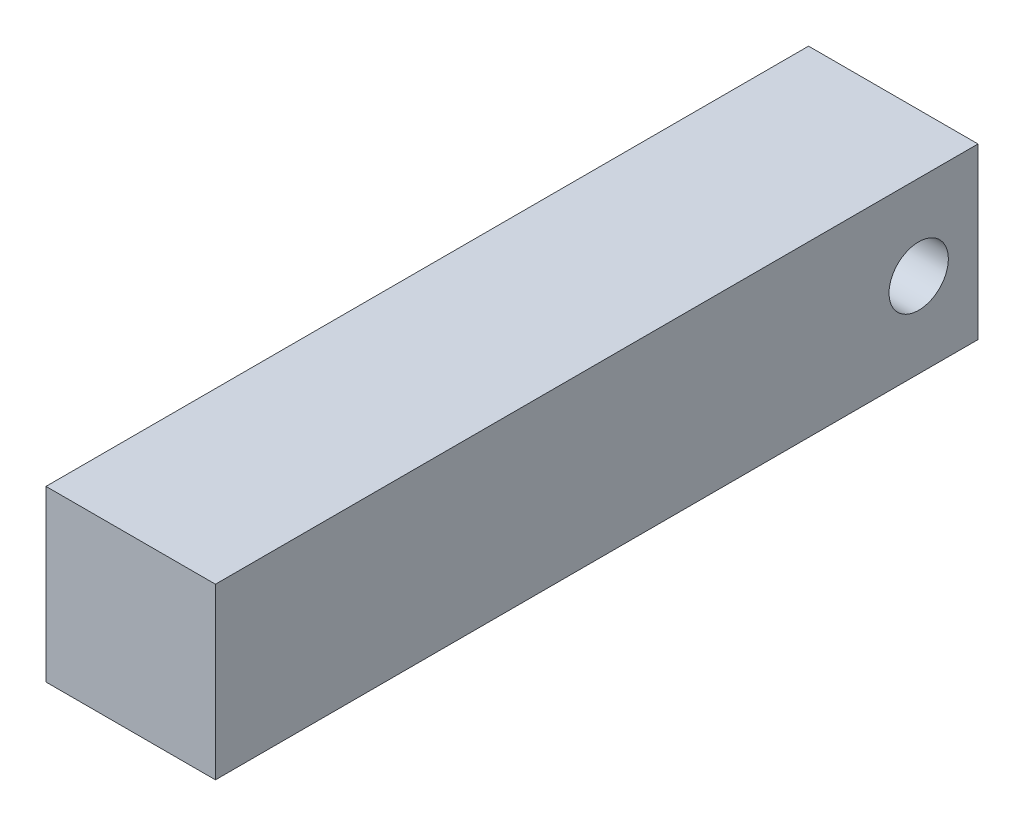
ISO-10303-21;
HEADER;
FILE_DESCRIPTION(('STEP AP214'),'2;1');
FILE_NAME('part.step','',(''),(''),'','','');
FILE_SCHEMA(('AUTOMOTIVE_DESIGN { 1 0 10303 214 1 1 1 1 }'));
ENDSEC;
DATA;
#1=APPLICATION_CONTEXT('core data for automotive mechanical design processes');
#2=APPLICATION_PROTOCOL_DEFINITION('international standard','automotive_design',2000,#1);
#3=PRODUCT_CONTEXT('',#1,'mechanical');
#4=PRODUCT('Part','Part','',(#3));
#5=PRODUCT_RELATED_PRODUCT_CATEGORY('part','',(#4));
#6=PRODUCT_DEFINITION_FORMATION('','',#4);
#7=PRODUCT_DEFINITION_CONTEXT('part definition',#1,'design');
#8=PRODUCT_DEFINITION('design','',#6,#7);
#9=PRODUCT_DEFINITION_SHAPE('','',#8);
#10=(LENGTH_UNIT() NAMED_UNIT(*) SI_UNIT(.MILLI.,.METRE.));
#11=(NAMED_UNIT(*) PLANE_ANGLE_UNIT() SI_UNIT($,.RADIAN.));
#12=(NAMED_UNIT(*) SI_UNIT($,.STERADIAN.) SOLID_ANGLE_UNIT());
#13=UNCERTAINTY_MEASURE_WITH_UNIT(LENGTH_MEASURE(1.E-05),#10,'distance_accuracy_value','');
#14=(GEOMETRIC_REPRESENTATION_CONTEXT(3) GLOBAL_UNCERTAINTY_ASSIGNED_CONTEXT((#13)) GLOBAL_UNIT_ASSIGNED_CONTEXT((#10,
#11,#12)) REPRESENTATION_CONTEXT('',''));
#15=CARTESIAN_POINT('',(0.,0.,0.));
#16=DIRECTION('',(0.,0.,1.));
#17=DIRECTION('',(1.,0.,0.));
#18=AXIS2_PLACEMENT_3D('',#15,#16,#17);
#19=CARTESIAN_POINT('',(0.,0.,45.));
#20=DIRECTION('',(0.,1.,0.));
#21=DIRECTION('',(0.,0.,1.));
#22=AXIS2_PLACEMENT_3D('',#19,#20,#21);
#23=PLANE('',#22);
#24=DIRECTION('',(1.,0.,0.));
#25=VECTOR('',#24,1.);
#26=CARTESIAN_POINT('',(0.,0.,0.));
#27=LINE('',#26,#25);
#28=CARTESIAN_POINT('',(0.,0.,0.));
#29=VERTEX_POINT('',#28);
#30=CARTESIAN_POINT('',(10.,0.,0.));
#31=VERTEX_POINT('',#30);
#32=EDGE_CURVE('E164',#29,#31,#27,.T.);
#33=ORIENTED_EDGE('',*,*,#32,.F.);
#34=DIRECTION('',(0.,0.,-1.));
#35=VECTOR('',#34,1.);
#36=CARTESIAN_POINT('',(0.,0.,45.));
#37=LINE('',#36,#35);
#38=CARTESIAN_POINT('',(0.,0.,45.));
#39=VERTEX_POINT('',#38);
#40=EDGE_CURVE('E11',#39,#29,#37,.T.);
#41=ORIENTED_EDGE('',*,*,#40,.F.);
#42=DIRECTION('',(1.,0.,0.));
#43=VECTOR('',#42,1.);
#44=CARTESIAN_POINT('',(0.,0.,45.));
#45=LINE('',#44,#43);
#46=CARTESIAN_POINT('',(10.,0.,45.));
#47=VERTEX_POINT('',#46);
#48=EDGE_CURVE('E173',#39,#47,#45,.T.);
#49=ORIENTED_EDGE('',*,*,#48,.T.);
#50=DIRECTION('',(0.,0.,-1.));
#51=VECTOR('',#50,1.);
#52=CARTESIAN_POINT('',(10.,0.,45.));
#53=LINE('',#52,#51);
#54=EDGE_CURVE('E48',#47,#31,#53,.T.);
#55=ORIENTED_EDGE('',*,*,#54,.T.);
#56=EDGE_LOOP('',(#33,#41,#49,#55));
#57=FACE_BOUND('',#56,.T.);
#58=ADVANCED_FACE('F44',(#57),#23,.T.);
#59=CARTESIAN_POINT('',(0.,0.,45.));
#60=DIRECTION('',(1.,0.,0.));
#61=DIRECTION('',(0.,1.,0.));
#62=AXIS2_PLACEMENT_3D('',#59,#60,#61);
#63=PLANE('',#62);
#64=DIRECTION('',(0.,-1.,0.));
#65=VECTOR('',#64,1.);
#66=CARTESIAN_POINT('',(0.,0.,0.));
#67=LINE('',#66,#65);
#68=CARTESIAN_POINT('',(0.,-10.,0.));
#69=VERTEX_POINT('',#68);
#70=EDGE_CURVE('E171',#29,#69,#67,.T.);
#71=ORIENTED_EDGE('',*,*,#70,.T.);
#72=DIRECTION('',(0.,0.,-1.));
#73=VECTOR('',#72,1.);
#74=CARTESIAN_POINT('',(0.,-10.,45.));
#75=LINE('',#74,#73);
#76=CARTESIAN_POINT('',(0.,-10.,45.));
#77=VERTEX_POINT('',#76);
#78=EDGE_CURVE('E53',#77,#69,#75,.T.);
#79=ORIENTED_EDGE('',*,*,#78,.F.);
#80=DIRECTION('',(0.,-1.,0.));
#81=VECTOR('',#80,1.);
#82=CARTESIAN_POINT('',(0.,0.,45.));
#83=LINE('',#82,#81);
#84=EDGE_CURVE('E182',#39,#77,#83,.T.);
#85=ORIENTED_EDGE('',*,*,#84,.F.);
#86=ORIENTED_EDGE('',*,*,#40,.T.);
#87=EDGE_LOOP('',(#71,#79,#85,#86));
#88=FACE_BOUND('',#87,.T.);
#89=ADVANCED_FACE('F207',(#88),#63,.F.);
#90=CARTESIAN_POINT('',(0.,-10.,45.));
#91=DIRECTION('',(0.,1.,0.));
#92=DIRECTION('',(0.,0.,1.));
#93=AXIS2_PLACEMENT_3D('',#90,#91,#92);
#94=PLANE('',#93);
#95=DIRECTION('',(1.,0.,0.));
#96=VECTOR('',#95,1.);
#97=CARTESIAN_POINT('',(0.,-10.,0.));
#98=LINE('',#97,#96);
#99=CARTESIAN_POINT('',(10.,-10.,0.));
#100=VERTEX_POINT('',#99);
#101=EDGE_CURVE('E193',#69,#100,#98,.T.);
#102=ORIENTED_EDGE('',*,*,#101,.T.);
#103=DIRECTION('',(0.,0.,-1.));
#104=VECTOR('',#103,1.);
#105=CARTESIAN_POINT('',(10.,-10.,45.));
#106=LINE('',#105,#104);
#107=CARTESIAN_POINT('',(10.,-10.,45.));
#108=VERTEX_POINT('',#107);
#109=EDGE_CURVE('E200',#108,#100,#106,.T.);
#110=ORIENTED_EDGE('',*,*,#109,.F.);
#111=DIRECTION('',(1.,0.,0.));
#112=VECTOR('',#111,1.);
#113=CARTESIAN_POINT('',(0.,-10.,45.));
#114=LINE('',#113,#112);
#115=EDGE_CURVE('E176',#77,#108,#114,.T.);
#116=ORIENTED_EDGE('',*,*,#115,.F.);
#117=ORIENTED_EDGE('',*,*,#78,.T.);
#118=EDGE_LOOP('',(#102,#110,#116,#117));
#119=FACE_BOUND('',#118,.T.);
#120=ADVANCED_FACE('F215',(#119),#94,.F.);
#121=CARTESIAN_POINT('',(10.,0.,45.));
#122=DIRECTION('',(1.,0.,0.));
#123=DIRECTION('',(0.,1.,0.));
#124=AXIS2_PLACEMENT_3D('',#121,#122,#123);
#125=PLANE('',#124);
#126=CARTESIAN_POINT('',(10.,-5.,3.5));
#127=DIRECTION('',(1.,0.,0.));
#128=DIRECTION('',(0.,1.,0.));
#129=AXIS2_PLACEMENT_3D('',#126,#127,#128);
#130=CIRCLE('',#129,1.75);
#131=CARTESIAN_POINT('',(10.,-3.25,3.5));
#132=VERTEX_POINT('',#131);
#133=EDGE_CURVE('E316',#132,#132,#130,.T.);
#134=ORIENTED_EDGE('',*,*,#133,.F.);
#135=EDGE_LOOP('',(#134));
#136=FACE_BOUND('',#135,.T.);
#137=DIRECTION('',(0.,-1.,0.));
#138=VECTOR('',#137,1.);
#139=CARTESIAN_POINT('',(10.,0.,0.));
#140=LINE('',#139,#138);
#141=EDGE_CURVE('E189',#31,#100,#140,.T.);
#142=ORIENTED_EDGE('',*,*,#141,.F.);
#143=ORIENTED_EDGE('',*,*,#54,.F.);
#144=DIRECTION('',(0.,-1.,0.));
#145=VECTOR('',#144,1.);
#146=CARTESIAN_POINT('',(10.,0.,45.));
#147=LINE('',#146,#145);
#148=EDGE_CURVE('E175',#47,#108,#147,.T.);
#149=ORIENTED_EDGE('',*,*,#148,.T.);
#150=ORIENTED_EDGE('',*,*,#109,.T.);
#151=EDGE_LOOP('',(#142,#143,#149,#150));
#152=FACE_BOUND('',#151,.T.);
#153=ADVANCED_FACE('F204',(#136,#152),#125,.T.);
#154=CARTESIAN_POINT('',(0.,0.,45.));
#155=DIRECTION('',(0.,0.,-1.));
#156=DIRECTION('',(-1.,0.,0.));
#157=AXIS2_PLACEMENT_3D('',#154,#155,#156);
#158=PLANE('',#157);
#159=ORIENTED_EDGE('',*,*,#48,.F.);
#160=ORIENTED_EDGE('',*,*,#84,.T.);
#161=ORIENTED_EDGE('',*,*,#115,.T.);
#162=ORIENTED_EDGE('',*,*,#148,.F.);
#163=EDGE_LOOP('',(#159,#160,#161,#162));
#164=FACE_BOUND('',#163,.T.);
#165=ADVANCED_FACE('F212',(#164),#158,.F.);
#166=CARTESIAN_POINT('',(0.,0.,0.));
#167=DIRECTION('',(0.,0.,-1.));
#168=DIRECTION('',(-1.,0.,0.));
#169=AXIS2_PLACEMENT_3D('',#166,#167,#168);
#170=PLANE('',#169);
#171=DIRECTION('',(0.,-1.,0.));
#172=VECTOR('',#171,1.);
#173=CARTESIAN_POINT('',(6.5,-2.5,0.));
#174=LINE('',#173,#172);
#175=CARTESIAN_POINT('',(6.5,-2.5,0.));
#176=VERTEX_POINT('',#175);
#177=CARTESIAN_POINT('',(6.5,-7.5,0.));
#178=VERTEX_POINT('',#177);
#179=EDGE_CURVE('E64',#176,#178,#174,.T.);
#180=ORIENTED_EDGE('',*,*,#179,.F.);
#181=DIRECTION('',(1.,0.,0.));
#182=VECTOR('',#181,1.);
#183=CARTESIAN_POINT('',(6.5,-2.5,0.));
#184=LINE('',#183,#182);
#185=CARTESIAN_POINT('',(3.5,-2.5,0.));
#186=VERTEX_POINT('',#185);
#187=EDGE_CURVE('E137',#186,#176,#184,.T.);
#188=ORIENTED_EDGE('',*,*,#187,.F.);
#189=DIRECTION('',(0.,1.,0.));
#190=VECTOR('',#189,1.);
#191=CARTESIAN_POINT('',(3.5,-2.5,0.));
#192=LINE('',#191,#190);
#193=CARTESIAN_POINT('',(3.5,-7.5,0.));
#194=VERTEX_POINT('',#193);
#195=EDGE_CURVE('E145',#194,#186,#192,.T.);
#196=ORIENTED_EDGE('',*,*,#195,.F.);
#197=DIRECTION('',(-1.,0.,0.));
#198=VECTOR('',#197,1.);
#199=CARTESIAN_POINT('',(6.5,-7.5,0.));
#200=LINE('',#199,#198);
#201=EDGE_CURVE('E156',#178,#194,#200,.T.);
#202=ORIENTED_EDGE('',*,*,#201,.F.);
#203=EDGE_LOOP('',(#180,#188,#196,#202));
#204=FACE_BOUND('',#203,.T.);
#205=ORIENTED_EDGE('',*,*,#32,.T.);
#206=ORIENTED_EDGE('',*,*,#141,.T.);
#207=ORIENTED_EDGE('',*,*,#101,.F.);
#208=ORIENTED_EDGE('',*,*,#70,.F.);
#209=EDGE_LOOP('',(#205,#206,#207,#208));
#210=FACE_BOUND('',#209,.T.);
#211=ADVANCED_FACE('F210',(#204,#210),#170,.T.);
#212=CARTESIAN_POINT('',(6.5,-2.5,7.));
#213=DIRECTION('',(1.,0.,0.));
#214=DIRECTION('',(0.,1.,0.));
#215=AXIS2_PLACEMENT_3D('',#212,#213,#214);
#216=PLANE('',#215);
#217=CARTESIAN_POINT('',(6.5,-5.,3.5));
#218=DIRECTION('',(1.,0.,0.));
#219=DIRECTION('',(0.,1.,0.));
#220=AXIS2_PLACEMENT_3D('',#217,#218,#219);
#221=CIRCLE('',#220,1.75);
#222=CARTESIAN_POINT('',(6.5,-3.25,3.5));
#223=VERTEX_POINT('',#222);
#224=EDGE_CURVE('E150',#223,#223,#221,.F.);
#225=ORIENTED_EDGE('',*,*,#224,.F.);
#226=EDGE_LOOP('',(#225));
#227=FACE_BOUND('',#226,.T.);
#228=ORIENTED_EDGE('',*,*,#179,.T.);
#229=DIRECTION('',(0.,0.,-1.));
#230=VECTOR('',#229,1.);
#231=CARTESIAN_POINT('',(6.5,-7.5,7.));
#232=LINE('',#231,#230);
#233=CARTESIAN_POINT('',(6.5,-7.5,7.));
#234=VERTEX_POINT('',#233);
#235=EDGE_CURVE('E113',#234,#178,#232,.T.);
#236=ORIENTED_EDGE('',*,*,#235,.F.);
#237=DIRECTION('',(0.,-1.,0.));
#238=VECTOR('',#237,1.);
#239=CARTESIAN_POINT('',(6.5,-2.5,7.));
#240=LINE('',#239,#238);
#241=CARTESIAN_POINT('',(6.5,-2.5,7.));
#242=VERTEX_POINT('',#241);
#243=EDGE_CURVE('E120',#242,#234,#240,.T.);
#244=ORIENTED_EDGE('',*,*,#243,.F.);
#245=DIRECTION('',(0.,0.,-1.));
#246=VECTOR('',#245,1.);
#247=CARTESIAN_POINT('',(6.5,-2.5,7.));
#248=LINE('',#247,#246);
#249=EDGE_CURVE('E165',#242,#176,#248,.T.);
#250=ORIENTED_EDGE('',*,*,#249,.T.);
#251=EDGE_LOOP('',(#228,#236,#244,#250));
#252=FACE_BOUND('',#251,.T.);
#253=ADVANCED_FACE('F119',(#227,#252),#216,.F.);
#254=CARTESIAN_POINT('',(6.5,-2.5,7.));
#255=DIRECTION('',(0.,1.,0.));
#256=DIRECTION('',(0.,0.,1.));
#257=AXIS2_PLACEMENT_3D('',#254,#255,#256);
#258=PLANE('',#257);
#259=ORIENTED_EDGE('',*,*,#187,.T.);
#260=ORIENTED_EDGE('',*,*,#249,.F.);
#261=DIRECTION('',(1.,0.,0.));
#262=VECTOR('',#261,1.);
#263=CARTESIAN_POINT('',(6.5,-2.5,7.));
#264=LINE('',#263,#262);
#265=CARTESIAN_POINT('',(3.5,-2.5,7.));
#266=VERTEX_POINT('',#265);
#267=EDGE_CURVE('E127',#266,#242,#264,.T.);
#268=ORIENTED_EDGE('',*,*,#267,.F.);
#269=DIRECTION('',(0.,0.,-1.));
#270=VECTOR('',#269,1.);
#271=CARTESIAN_POINT('',(3.5,-2.5,7.));
#272=LINE('',#271,#270);
#273=EDGE_CURVE('E167',#266,#186,#272,.T.);
#274=ORIENTED_EDGE('',*,*,#273,.T.);
#275=EDGE_LOOP('',(#259,#260,#268,#274));
#276=FACE_BOUND('',#275,.T.);
#277=ADVANCED_FACE('F270',(#276),#258,.F.);
#278=CARTESIAN_POINT('',(3.5,-2.5,7.));
#279=DIRECTION('',(-1.,0.,0.));
#280=DIRECTION('',(0.,-1.,0.));
#281=AXIS2_PLACEMENT_3D('',#278,#279,#280);
#282=PLANE('',#281);
#283=ORIENTED_EDGE('',*,*,#195,.T.);
#284=ORIENTED_EDGE('',*,*,#273,.F.);
#285=DIRECTION('',(0.,1.,0.));
#286=VECTOR('',#285,1.);
#287=CARTESIAN_POINT('',(3.5,-2.5,7.));
#288=LINE('',#287,#286);
#289=CARTESIAN_POINT('',(3.5,-7.5,7.));
#290=VERTEX_POINT('',#289);
#291=EDGE_CURVE('E131',#290,#266,#288,.T.);
#292=ORIENTED_EDGE('',*,*,#291,.F.);
#293=DIRECTION('',(0.,0.,-1.));
#294=VECTOR('',#293,1.);
#295=CARTESIAN_POINT('',(3.5,-7.5,7.));
#296=LINE('',#295,#294);
#297=EDGE_CURVE('E122',#290,#194,#296,.T.);
#298=ORIENTED_EDGE('',*,*,#297,.T.);
#299=EDGE_LOOP('',(#283,#284,#292,#298));
#300=FACE_BOUND('',#299,.T.);
#301=ADVANCED_FACE('F277',(#300),#282,.F.);
#302=CARTESIAN_POINT('',(6.5,-7.5,7.));
#303=DIRECTION('',(0.,-1.,0.));
#304=DIRECTION('',(0.,0.,-1.));
#305=AXIS2_PLACEMENT_3D('',#302,#303,#304);
#306=PLANE('',#305);
#307=ORIENTED_EDGE('',*,*,#201,.T.);
#308=ORIENTED_EDGE('',*,*,#297,.F.);
#309=DIRECTION('',(-1.,0.,0.));
#310=VECTOR('',#309,1.);
#311=CARTESIAN_POINT('',(6.5,-7.5,7.));
#312=LINE('',#311,#310);
#313=EDGE_CURVE('E129',#234,#290,#312,.T.);
#314=ORIENTED_EDGE('',*,*,#313,.F.);
#315=ORIENTED_EDGE('',*,*,#235,.T.);
#316=EDGE_LOOP('',(#307,#308,#314,#315));
#317=FACE_BOUND('',#316,.T.);
#318=ADVANCED_FACE('F128',(#317),#306,.F.);
#319=CARTESIAN_POINT('',(0.,0.,7.));
#320=DIRECTION('',(0.,0.,-1.));
#321=DIRECTION('',(-1.,0.,0.));
#322=AXIS2_PLACEMENT_3D('',#319,#320,#321);
#323=PLANE('',#322);
#324=ORIENTED_EDGE('',*,*,#243,.T.);
#325=ORIENTED_EDGE('',*,*,#313,.T.);
#326=ORIENTED_EDGE('',*,*,#291,.T.);
#327=ORIENTED_EDGE('',*,*,#267,.T.);
#328=EDGE_LOOP('',(#324,#325,#326,#327));
#329=FACE_BOUND('',#328,.T.);
#330=ADVANCED_FACE('F140',(#329),#323,.T.);
#331=CARTESIAN_POINT('',(-0.001000000000001,-5.,3.5));
#332=DIRECTION('',(1.,0.,0.));
#333=DIRECTION('',(0.,1.,0.));
#334=AXIS2_PLACEMENT_3D('',#331,#332,#333);
#335=CYLINDRICAL_SURFACE('',#334,1.75);
#336=ORIENTED_EDGE('',*,*,#133,.T.);
#337=EDGE_LOOP('',(#336));
#338=FACE_BOUND('',#337,.T.);
#339=ORIENTED_EDGE('',*,*,#224,.T.);
#340=EDGE_LOOP('',(#339));
#341=FACE_BOUND('',#340,.T.);
#342=ADVANCED_FACE('F305',(#338,#341),#335,.F.);
#343=CLOSED_SHELL('',(#58,#89,#120,#153,#165,#211,#253,#277,#301,#318,#330,#342));
#344=MANIFOLD_SOLID_BREP('B2',#343);
#345=ADVANCED_BREP_SHAPE_REPRESENTATION('',(#18,#344),#14);
#346=SHAPE_DEFINITION_REPRESENTATION(#9,#345);
ENDSEC;
END-ISO-10303-21;
